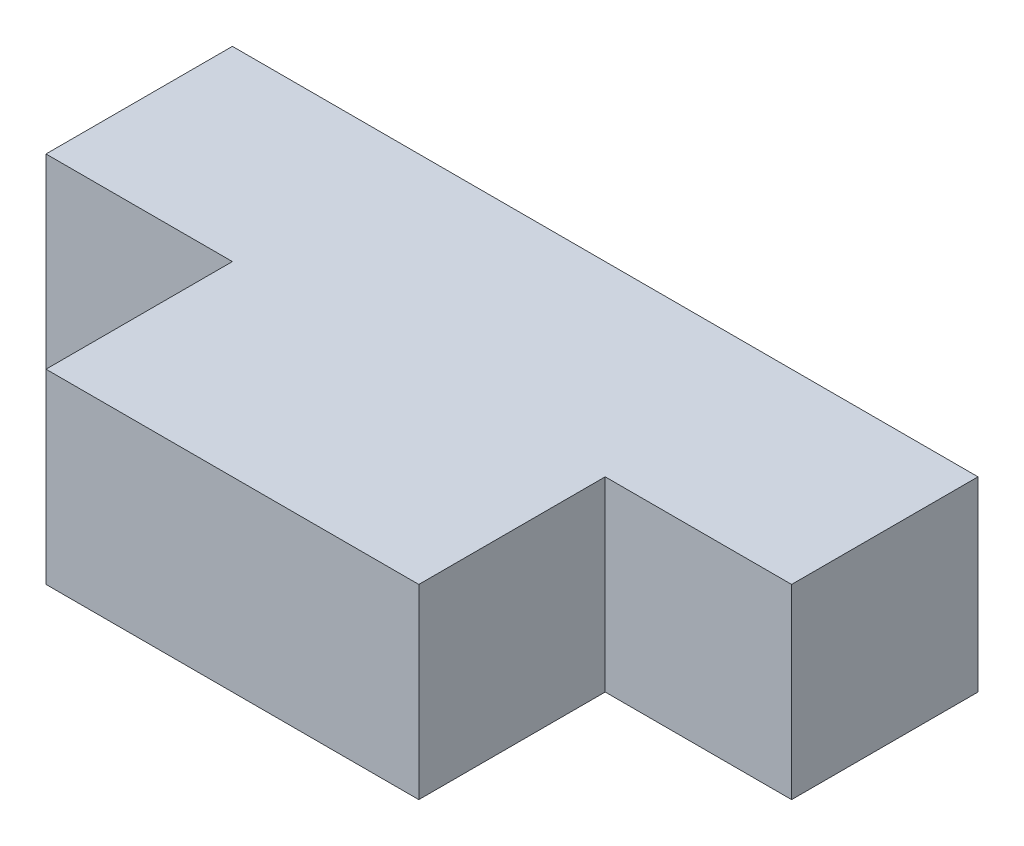
ISO-10303-21;
HEADER;
FILE_DESCRIPTION(('STEP AP214'),'2;1');
FILE_NAME('part.step','',(''),(''),'','','');
FILE_SCHEMA(('AUTOMOTIVE_DESIGN { 1 0 10303 214 1 1 1 1 }'));
ENDSEC;
DATA;
#1=APPLICATION_CONTEXT('core data for automotive mechanical design processes');
#2=APPLICATION_PROTOCOL_DEFINITION('international standard','automotive_design',2000,#1);
#3=PRODUCT_CONTEXT('',#1,'mechanical');
#4=PRODUCT('Part','Part','',(#3));
#5=PRODUCT_RELATED_PRODUCT_CATEGORY('part','',(#4));
#6=PRODUCT_DEFINITION_FORMATION('','',#4);
#7=PRODUCT_DEFINITION_CONTEXT('part definition',#1,'design');
#8=PRODUCT_DEFINITION('design','',#6,#7);
#9=PRODUCT_DEFINITION_SHAPE('','',#8);
#10=(LENGTH_UNIT() NAMED_UNIT(*) SI_UNIT(.MILLI.,.METRE.));
#11=(NAMED_UNIT(*) PLANE_ANGLE_UNIT() SI_UNIT($,.RADIAN.));
#12=(NAMED_UNIT(*) SI_UNIT($,.STERADIAN.) SOLID_ANGLE_UNIT());
#13=UNCERTAINTY_MEASURE_WITH_UNIT(LENGTH_MEASURE(1.E-05),#10,'distance_accuracy_value','');
#14=(GEOMETRIC_REPRESENTATION_CONTEXT(3) GLOBAL_UNCERTAINTY_ASSIGNED_CONTEXT((#13)) GLOBAL_UNIT_ASSIGNED_CONTEXT((#10,
#11,#12)) REPRESENTATION_CONTEXT('',''));
#15=CARTESIAN_POINT('',(0.,0.,0.));
#16=DIRECTION('',(0.,0.,1.));
#17=DIRECTION('',(1.,0.,0.));
#18=AXIS2_PLACEMENT_3D('',#15,#16,#17);
#19=CARTESIAN_POINT('',(20.,5.,0.));
#20=DIRECTION('',(0.,0.,1.));
#21=DIRECTION('',(1.,0.,0.));
#22=AXIS2_PLACEMENT_3D('',#19,#20,#21);
#23=PLANE('',#22);
#24=DIRECTION('',(-1.,0.,0.));
#25=VECTOR('',#24,1.);
#26=CARTESIAN_POINT('',(20.,0.,0.));
#27=LINE('',#26,#25);
#28=CARTESIAN_POINT('',(20.,0.,0.));
#29=VERTEX_POINT('',#28);
#30=CARTESIAN_POINT('',(0.,0.,0.));
#31=VERTEX_POINT('',#30);
#32=EDGE_CURVE('E131',#29,#31,#27,.T.);
#33=ORIENTED_EDGE('',*,*,#32,.T.);
#34=DIRECTION('',(0.,-1.,0.));
#35=VECTOR('',#34,1.);
#36=CARTESIAN_POINT('',(0.,5.,0.));
#37=LINE('',#36,#35);
#38=CARTESIAN_POINT('',(0.,5.,0.));
#39=VERTEX_POINT('',#38);
#40=EDGE_CURVE('E11',#39,#31,#37,.T.);
#41=ORIENTED_EDGE('',*,*,#40,.F.);
#42=DIRECTION('',(-1.,0.,0.));
#43=VECTOR('',#42,1.);
#44=CARTESIAN_POINT('',(20.,5.,0.));
#45=LINE('',#44,#43);
#46=CARTESIAN_POINT('',(20.,5.,0.));
#47=VERTEX_POINT('',#46);
#48=EDGE_CURVE('E145',#47,#39,#45,.T.);
#49=ORIENTED_EDGE('',*,*,#48,.F.);
#50=DIRECTION('',(0.,-1.,0.));
#51=VECTOR('',#50,1.);
#52=CARTESIAN_POINT('',(20.,5.,0.));
#53=LINE('',#52,#51);
#54=EDGE_CURVE('E127',#47,#29,#53,.T.);
#55=ORIENTED_EDGE('',*,*,#54,.T.);
#56=EDGE_LOOP('',(#33,#41,#49,#55));
#57=FACE_BOUND('',#56,.T.);
#58=ADVANCED_FACE('F35',(#57),#23,.F.);
#59=CARTESIAN_POINT('',(0.,5.,0.));
#60=DIRECTION('',(1.,0.,0.));
#61=DIRECTION('',(0.,0.,-1.));
#62=AXIS2_PLACEMENT_3D('',#59,#60,#61);
#63=PLANE('',#62);
#64=DIRECTION('',(0.,0.,1.));
#65=VECTOR('',#64,1.);
#66=CARTESIAN_POINT('',(0.,0.,0.));
#67=LINE('',#66,#65);
#68=CARTESIAN_POINT('',(0.,0.,5.));
#69=VERTEX_POINT('',#68);
#70=EDGE_CURVE('E134',#31,#69,#67,.T.);
#71=ORIENTED_EDGE('',*,*,#70,.T.);
#72=DIRECTION('',(0.,-1.,0.));
#73=VECTOR('',#72,1.);
#74=CARTESIAN_POINT('',(0.,5.,5.));
#75=LINE('',#74,#73);
#76=CARTESIAN_POINT('',(0.,5.,5.));
#77=VERTEX_POINT('',#76);
#78=EDGE_CURVE('E43',#77,#69,#75,.T.);
#79=ORIENTED_EDGE('',*,*,#78,.F.);
#80=DIRECTION('',(0.,0.,1.));
#81=VECTOR('',#80,1.);
#82=CARTESIAN_POINT('',(0.,5.,0.));
#83=LINE('',#82,#81);
#84=EDGE_CURVE('E94',#39,#77,#83,.T.);
#85=ORIENTED_EDGE('',*,*,#84,.F.);
#86=ORIENTED_EDGE('',*,*,#40,.T.);
#87=EDGE_LOOP('',(#71,#79,#85,#86));
#88=FACE_BOUND('',#87,.T.);
#89=ADVANCED_FACE('F180',(#88),#63,.F.);
#90=CARTESIAN_POINT('',(0.,5.,5.));
#91=DIRECTION('',(0.,0.,-1.));
#92=DIRECTION('',(-1.,0.,0.));
#93=AXIS2_PLACEMENT_3D('',#90,#91,#92);
#94=PLANE('',#93);
#95=DIRECTION('',(1.,0.,0.));
#96=VECTOR('',#95,1.);
#97=CARTESIAN_POINT('',(0.,0.,5.));
#98=LINE('',#97,#96);
#99=CARTESIAN_POINT('',(5.,0.,5.));
#100=VERTEX_POINT('',#99);
#101=EDGE_CURVE('E136',#69,#100,#98,.T.);
#102=ORIENTED_EDGE('',*,*,#101,.T.);
#103=DIRECTION('',(0.,-1.,0.));
#104=VECTOR('',#103,1.);
#105=CARTESIAN_POINT('',(5.,5.,5.));
#106=LINE('',#105,#104);
#107=CARTESIAN_POINT('',(5.,5.,5.));
#108=VERTEX_POINT('',#107);
#109=EDGE_CURVE('E152',#108,#100,#106,.T.);
#110=ORIENTED_EDGE('',*,*,#109,.F.);
#111=DIRECTION('',(1.,0.,0.));
#112=VECTOR('',#111,1.);
#113=CARTESIAN_POINT('',(0.,5.,5.));
#114=LINE('',#113,#112);
#115=EDGE_CURVE('E160',#77,#108,#114,.T.);
#116=ORIENTED_EDGE('',*,*,#115,.F.);
#117=ORIENTED_EDGE('',*,*,#78,.T.);
#118=EDGE_LOOP('',(#102,#110,#116,#117));
#119=FACE_BOUND('',#118,.T.);
#120=ADVANCED_FACE('F158',(#119),#94,.F.);
#121=CARTESIAN_POINT('',(5.,5.,5.));
#122=DIRECTION('',(1.,0.,0.));
#123=DIRECTION('',(0.,0.,-1.));
#124=AXIS2_PLACEMENT_3D('',#121,#122,#123);
#125=PLANE('',#124);
#126=DIRECTION('',(0.,0.,1.));
#127=VECTOR('',#126,1.);
#128=CARTESIAN_POINT('',(5.,0.,5.));
#129=LINE('',#128,#127);
#130=CARTESIAN_POINT('',(5.,0.,10.));
#131=VERTEX_POINT('',#130);
#132=EDGE_CURVE('E138',#100,#131,#129,.T.);
#133=ORIENTED_EDGE('',*,*,#132,.T.);
#134=DIRECTION('',(0.,-1.,0.));
#135=VECTOR('',#134,1.);
#136=CARTESIAN_POINT('',(5.,5.,10.));
#137=LINE('',#136,#135);
#138=CARTESIAN_POINT('',(5.,5.,10.));
#139=VERTEX_POINT('',#138);
#140=EDGE_CURVE('E149',#139,#131,#137,.T.);
#141=ORIENTED_EDGE('',*,*,#140,.F.);
#142=DIRECTION('',(0.,0.,1.));
#143=VECTOR('',#142,1.);
#144=CARTESIAN_POINT('',(5.,5.,5.));
#145=LINE('',#144,#143);
#146=EDGE_CURVE('E172',#108,#139,#145,.T.);
#147=ORIENTED_EDGE('',*,*,#146,.F.);
#148=ORIENTED_EDGE('',*,*,#109,.T.);
#149=EDGE_LOOP('',(#133,#141,#147,#148));
#150=FACE_BOUND('',#149,.T.);
#151=ADVANCED_FACE('F168',(#150),#125,.F.);
#152=CARTESIAN_POINT('',(5.,5.,10.));
#153=DIRECTION('',(0.,0.,-1.));
#154=DIRECTION('',(-1.,0.,0.));
#155=AXIS2_PLACEMENT_3D('',#152,#153,#154);
#156=PLANE('',#155);
#157=DIRECTION('',(1.,0.,0.));
#158=VECTOR('',#157,1.);
#159=CARTESIAN_POINT('',(5.,0.,10.));
#160=LINE('',#159,#158);
#161=CARTESIAN_POINT('',(15.,0.,10.));
#162=VERTEX_POINT('',#161);
#163=EDGE_CURVE('E140',#131,#162,#160,.T.);
#164=ORIENTED_EDGE('',*,*,#163,.T.);
#165=DIRECTION('',(0.,-1.,0.));
#166=VECTOR('',#165,1.);
#167=CARTESIAN_POINT('',(15.,5.,10.));
#168=LINE('',#167,#166);
#169=CARTESIAN_POINT('',(15.,5.,10.));
#170=VERTEX_POINT('',#169);
#171=EDGE_CURVE('E122',#170,#162,#168,.T.);
#172=ORIENTED_EDGE('',*,*,#171,.F.);
#173=DIRECTION('',(1.,0.,0.));
#174=VECTOR('',#173,1.);
#175=CARTESIAN_POINT('',(5.,5.,10.));
#176=LINE('',#175,#174);
#177=EDGE_CURVE('E113',#139,#170,#176,.T.);
#178=ORIENTED_EDGE('',*,*,#177,.F.);
#179=ORIENTED_EDGE('',*,*,#140,.T.);
#180=EDGE_LOOP('',(#164,#172,#178,#179));
#181=FACE_BOUND('',#180,.T.);
#182=ADVANCED_FACE('F171',(#181),#156,.F.);
#183=CARTESIAN_POINT('',(15.,5.,10.));
#184=DIRECTION('',(-1.,0.,0.));
#185=DIRECTION('',(0.,0.,1.));
#186=AXIS2_PLACEMENT_3D('',#183,#184,#185);
#187=PLANE('',#186);
#188=DIRECTION('',(0.,0.,-1.));
#189=VECTOR('',#188,1.);
#190=CARTESIAN_POINT('',(15.,0.,10.));
#191=LINE('',#190,#189);
#192=CARTESIAN_POINT('',(15.,0.,5.));
#193=VERTEX_POINT('',#192);
#194=EDGE_CURVE('E121',#162,#193,#191,.T.);
#195=ORIENTED_EDGE('',*,*,#194,.T.);
#196=DIRECTION('',(0.,-1.,0.));
#197=VECTOR('',#196,1.);
#198=CARTESIAN_POINT('',(15.,5.,5.));
#199=LINE('',#198,#197);
#200=CARTESIAN_POINT('',(15.,5.,5.));
#201=VERTEX_POINT('',#200);
#202=EDGE_CURVE('E118',#201,#193,#199,.T.);
#203=ORIENTED_EDGE('',*,*,#202,.F.);
#204=DIRECTION('',(0.,0.,-1.));
#205=VECTOR('',#204,1.);
#206=CARTESIAN_POINT('',(15.,5.,10.));
#207=LINE('',#206,#205);
#208=EDGE_CURVE('E107',#170,#201,#207,.T.);
#209=ORIENTED_EDGE('',*,*,#208,.F.);
#210=ORIENTED_EDGE('',*,*,#171,.T.);
#211=EDGE_LOOP('',(#195,#203,#209,#210));
#212=FACE_BOUND('',#211,.T.);
#213=ADVANCED_FACE('F119',(#212),#187,.F.);
#214=CARTESIAN_POINT('',(15.,5.,5.));
#215=DIRECTION('',(0.,0.,-1.));
#216=DIRECTION('',(-1.,0.,0.));
#217=AXIS2_PLACEMENT_3D('',#214,#215,#216);
#218=PLANE('',#217);
#219=DIRECTION('',(1.,0.,0.));
#220=VECTOR('',#219,1.);
#221=CARTESIAN_POINT('',(15.,0.,5.));
#222=LINE('',#221,#220);
#223=CARTESIAN_POINT('',(20.,0.,5.));
#224=VERTEX_POINT('',#223);
#225=EDGE_CURVE('E80',#193,#224,#222,.T.);
#226=ORIENTED_EDGE('',*,*,#225,.T.);
#227=DIRECTION('',(0.,-1.,0.));
#228=VECTOR('',#227,1.);
#229=CARTESIAN_POINT('',(20.,5.,5.));
#230=LINE('',#229,#228);
#231=CARTESIAN_POINT('',(20.,5.,5.));
#232=VERTEX_POINT('',#231);
#233=EDGE_CURVE('E123',#232,#224,#230,.T.);
#234=ORIENTED_EDGE('',*,*,#233,.F.);
#235=DIRECTION('',(1.,0.,0.));
#236=VECTOR('',#235,1.);
#237=CARTESIAN_POINT('',(15.,5.,5.));
#238=LINE('',#237,#236);
#239=EDGE_CURVE('E111',#201,#232,#238,.T.);
#240=ORIENTED_EDGE('',*,*,#239,.F.);
#241=ORIENTED_EDGE('',*,*,#202,.T.);
#242=EDGE_LOOP('',(#226,#234,#240,#241));
#243=FACE_BOUND('',#242,.T.);
#244=ADVANCED_FACE('F125',(#243),#218,.F.);
#245=CARTESIAN_POINT('',(20.,5.,5.));
#246=DIRECTION('',(-1.,0.,0.));
#247=DIRECTION('',(0.,0.,1.));
#248=AXIS2_PLACEMENT_3D('',#245,#246,#247);
#249=PLANE('',#248);
#250=DIRECTION('',(0.,0.,-1.));
#251=VECTOR('',#250,1.);
#252=CARTESIAN_POINT('',(20.,0.,5.));
#253=LINE('',#252,#251);
#254=EDGE_CURVE('E86',#224,#29,#253,.T.);
#255=ORIENTED_EDGE('',*,*,#254,.T.);
#256=ORIENTED_EDGE('',*,*,#54,.F.);
#257=DIRECTION('',(0.,0.,-1.));
#258=VECTOR('',#257,1.);
#259=CARTESIAN_POINT('',(20.,5.,5.));
#260=LINE('',#259,#258);
#261=EDGE_CURVE('E51',#232,#47,#260,.T.);
#262=ORIENTED_EDGE('',*,*,#261,.F.);
#263=ORIENTED_EDGE('',*,*,#233,.T.);
#264=EDGE_LOOP('',(#255,#256,#262,#263));
#265=FACE_BOUND('',#264,.T.);
#266=ADVANCED_FACE('F196',(#265),#249,.F.);
#267=CARTESIAN_POINT('',(0.,5.,0.));
#268=DIRECTION('',(0.,1.,0.));
#269=DIRECTION('',(0.,0.,1.));
#270=AXIS2_PLACEMENT_3D('',#267,#268,#269);
#271=PLANE('',#270);
#272=ORIENTED_EDGE('',*,*,#48,.T.);
#273=ORIENTED_EDGE('',*,*,#84,.T.);
#274=ORIENTED_EDGE('',*,*,#115,.T.);
#275=ORIENTED_EDGE('',*,*,#146,.T.);
#276=ORIENTED_EDGE('',*,*,#177,.T.);
#277=ORIENTED_EDGE('',*,*,#208,.T.);
#278=ORIENTED_EDGE('',*,*,#239,.T.);
#279=ORIENTED_EDGE('',*,*,#261,.T.);
#280=EDGE_LOOP('',(#272,#273,#274,#275,#276,#277,#278,#279));
#281=FACE_BOUND('',#280,.T.);
#282=ADVANCED_FACE('F109',(#281),#271,.T.);
#283=CARTESIAN_POINT('',(0.,0.,0.));
#284=DIRECTION('',(0.,1.,0.));
#285=DIRECTION('',(0.,0.,1.));
#286=AXIS2_PLACEMENT_3D('',#283,#284,#285);
#287=PLANE('',#286);
#288=ORIENTED_EDGE('',*,*,#32,.F.);
#289=ORIENTED_EDGE('',*,*,#254,.F.);
#290=ORIENTED_EDGE('',*,*,#225,.F.);
#291=ORIENTED_EDGE('',*,*,#194,.F.);
#292=ORIENTED_EDGE('',*,*,#163,.F.);
#293=ORIENTED_EDGE('',*,*,#132,.F.);
#294=ORIENTED_EDGE('',*,*,#101,.F.);
#295=ORIENTED_EDGE('',*,*,#70,.F.);
#296=EDGE_LOOP('',(#288,#289,#290,#291,#292,#293,#294,#295));
#297=FACE_BOUND('',#296,.T.);
#298=ADVANCED_FACE('F164',(#297),#287,.F.);
#299=CLOSED_SHELL('',(#58,#89,#120,#151,#182,#213,#244,#266,#282,#298));
#300=MANIFOLD_SOLID_BREP('B2',#299);
#301=ADVANCED_BREP_SHAPE_REPRESENTATION('',(#18,#300),#14);
#302=SHAPE_DEFINITION_REPRESENTATION(#9,#301);
ENDSEC;
END-ISO-10303-21;
